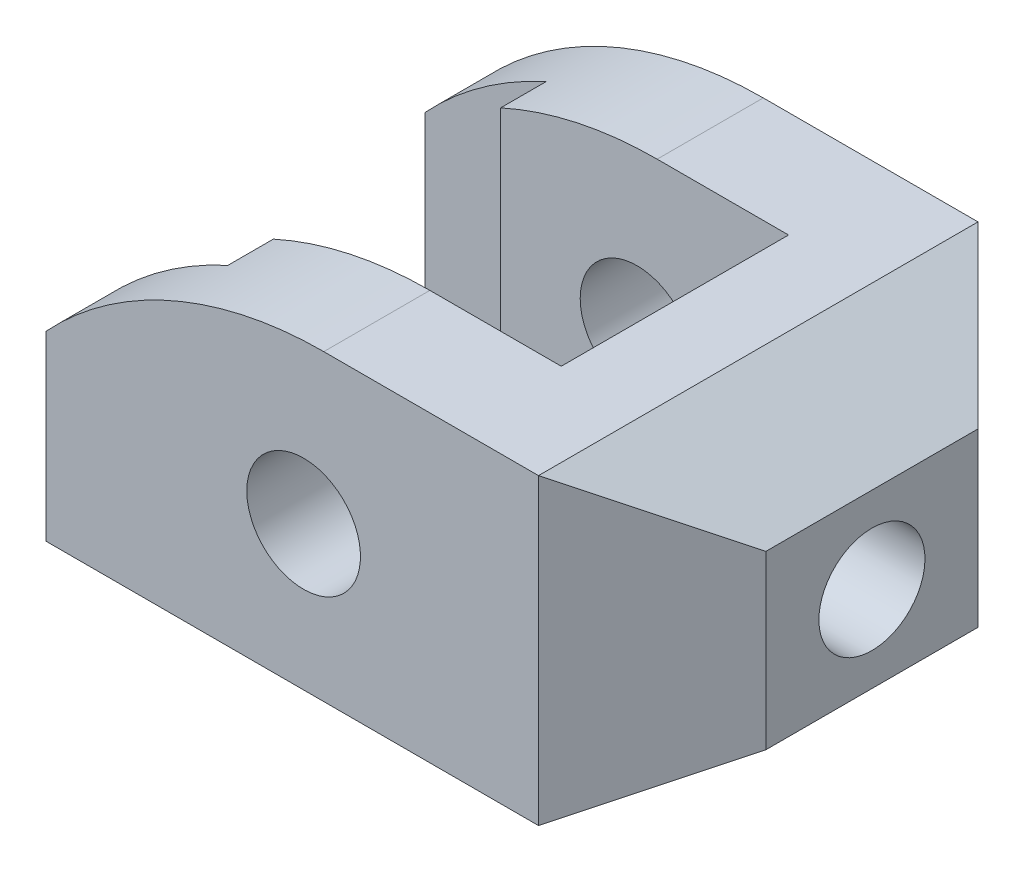
ISO-10303-21;
HEADER;
FILE_DESCRIPTION(('STEP AP214'),'2;1');
FILE_NAME('part.step','',(''),(''),'','','');
FILE_SCHEMA(('AUTOMOTIVE_DESIGN { 1 0 10303 214 1 1 1 1 }'));
ENDSEC;
DATA;
#1=APPLICATION_CONTEXT('core data for automotive mechanical design processes');
#2=APPLICATION_PROTOCOL_DEFINITION('international standard','automotive_design',2000,#1);
#3=PRODUCT_CONTEXT('',#1,'mechanical');
#4=PRODUCT('Part','Part','',(#3));
#5=PRODUCT_RELATED_PRODUCT_CATEGORY('part','',(#4));
#6=PRODUCT_DEFINITION_FORMATION('','',#4);
#7=PRODUCT_DEFINITION_CONTEXT('part definition',#1,'design');
#8=PRODUCT_DEFINITION('design','',#6,#7);
#9=PRODUCT_DEFINITION_SHAPE('','',#8);
#10=(LENGTH_UNIT() NAMED_UNIT(*) SI_UNIT(.MILLI.,.METRE.));
#11=(NAMED_UNIT(*) PLANE_ANGLE_UNIT() SI_UNIT($,.RADIAN.));
#12=(NAMED_UNIT(*) SI_UNIT($,.STERADIAN.) SOLID_ANGLE_UNIT());
#13=UNCERTAINTY_MEASURE_WITH_UNIT(LENGTH_MEASURE(1.E-05),#10,'distance_accuracy_value','');
#14=(GEOMETRIC_REPRESENTATION_CONTEXT(3) GLOBAL_UNCERTAINTY_ASSIGNED_CONTEXT((#13)) GLOBAL_UNIT_ASSIGNED_CONTEXT((#10,
#11,#12)) REPRESENTATION_CONTEXT('',''));
#15=CARTESIAN_POINT('',(0.,0.,0.));
#16=DIRECTION('',(0.,0.,1.));
#17=DIRECTION('',(1.,0.,0.));
#18=AXIS2_PLACEMENT_3D('',#15,#16,#17);
#19=CARTESIAN_POINT('',(2.66060555964671,-29.,58.));
#20=DIRECTION('',(0.,0.,-1.));
#21=DIRECTION('',(-1.,0.,0.));
#22=AXIS2_PLACEMENT_3D('',#19,#20,#21);
#23=CYLINDRICAL_SURFACE('',#22,50.);
#24=CARTESIAN_POINT('',(2.66060555964671,-29.,50.));
#25=DIRECTION('',(0.,0.,-1.));
#26=DIRECTION('',(-1.,0.,0.));
#27=AXIS2_PLACEMENT_3D('',#24,#25,#26);
#28=CIRCLE('',#27,50.);
#29=CARTESIAN_POINT('',(-34.,5.00000000000002,50.));
#30=VERTEX_POINT('',#29);
#31=CARTESIAN_POINT('',(-18.,16.5317403347236,50.));
#32=VERTEX_POINT('',#31);
#33=EDGE_CURVE('E254',#30,#32,#28,.T.);
#34=ORIENTED_EDGE('',*,*,#33,.F.);
#35=DIRECTION('',(0.,0.,-1.));
#36=VECTOR('',#35,1.);
#37=CARTESIAN_POINT('',(-34.,5.,58.));
#38=LINE('',#37,#36);
#39=CARTESIAN_POINT('',(-34.,5.,58.));
#40=VERTEX_POINT('',#39);
#41=EDGE_CURVE('E202',#40,#30,#38,.T.);
#42=ORIENTED_EDGE('',*,*,#41,.F.);
#43=CARTESIAN_POINT('',(2.66060555964671,-29.,58.));
#44=DIRECTION('',(0.,0.,1.));
#45=DIRECTION('',(-1.,0.,0.));
#46=AXIS2_PLACEMENT_3D('',#43,#44,#45);
#47=CIRCLE('',#46,50.);
#48=CARTESIAN_POINT('',(2.66060555964671,21.,58.));
#49=VERTEX_POINT('',#48);
#50=EDGE_CURVE('E237',#49,#40,#47,.T.);
#51=ORIENTED_EDGE('',*,*,#50,.F.);
#52=DIRECTION('',(0.,0.,-1.));
#53=VECTOR('',#52,1.);
#54=CARTESIAN_POINT('',(2.66060555964671,21.,58.));
#55=LINE('',#54,#53);
#56=CARTESIAN_POINT('',(2.66060555964671,21.,44.));
#57=VERTEX_POINT('',#56);
#58=EDGE_CURVE('E231',#49,#57,#55,.T.);
#59=ORIENTED_EDGE('',*,*,#58,.T.);
#60=CARTESIAN_POINT('',(2.66060555964671,-29.,44.));
#61=DIRECTION('',(0.,0.,-1.));
#62=DIRECTION('',(-1.,0.,0.));
#63=AXIS2_PLACEMENT_3D('',#60,#61,#62);
#64=CIRCLE('',#63,50.);
#65=CARTESIAN_POINT('',(-18.,16.5317403347236,44.));
#66=VERTEX_POINT('',#65);
#67=EDGE_CURVE('E264',#66,#57,#64,.T.);
#68=ORIENTED_EDGE('',*,*,#67,.F.);
#69=DIRECTION('',(0.,0.,-1.));
#70=VECTOR('',#69,1.);
#71=CARTESIAN_POINT('',(-18.,16.5317403347236,58.));
#72=LINE('',#71,#70);
#73=EDGE_CURVE('E258',#32,#66,#72,.T.);
#74=ORIENTED_EDGE('',*,*,#73,.F.);
#75=EDGE_LOOP('',(#34,#42,#51,#59,#68,#74));
#76=FACE_BOUND('',#75,.T.);
#77=ADVANCED_FACE('F40',(#76),#23,.T.);
#78=CARTESIAN_POINT('',(2.66060555964671,-29.,14.));
#79=DIRECTION('',(0.,0.,1.));
#80=DIRECTION('',(1.,0.,0.));
#81=AXIS2_PLACEMENT_3D('',#78,#79,#80);
#82=CIRCLE('',#81,50.);
#83=CARTESIAN_POINT('',(2.66060555964671,21.,14.));
#84=VERTEX_POINT('',#83);
#85=CARTESIAN_POINT('',(-18.,16.5317403347236,14.));
#86=VERTEX_POINT('',#85);
#87=EDGE_CURVE('E215',#84,#86,#82,.T.);
#88=ORIENTED_EDGE('',*,*,#87,.F.);
#89=CARTESIAN_POINT('',(2.66060555964671,21.,0.));
#90=VERTEX_POINT('',#89);
#91=EDGE_CURVE('E234',#84,#90,#55,.T.);
#92=ORIENTED_EDGE('',*,*,#91,.T.);
#93=CARTESIAN_POINT('',(2.66060555964671,-29.,0.));
#94=DIRECTION('',(0.,0.,1.));
#95=DIRECTION('',(-1.,0.,0.));
#96=AXIS2_PLACEMENT_3D('',#93,#94,#95);
#97=CIRCLE('',#96,50.);
#98=CARTESIAN_POINT('',(-34.,5.,0.));
#99=VERTEX_POINT('',#98);
#100=EDGE_CURVE('E240',#90,#99,#97,.T.);
#101=ORIENTED_EDGE('',*,*,#100,.T.);
#102=CARTESIAN_POINT('',(-34.,5.00000000000002,8.));
#103=VERTEX_POINT('',#102);
#104=EDGE_CURVE('E201',#103,#99,#38,.T.);
#105=ORIENTED_EDGE('',*,*,#104,.F.);
#106=CARTESIAN_POINT('',(2.66060555964671,-29.,8.00000000000001));
#107=DIRECTION('',(0.,0.,1.));
#108=DIRECTION('',(1.,0.,0.));
#109=AXIS2_PLACEMENT_3D('',#106,#107,#108);
#110=CIRCLE('',#109,50.);
#111=CARTESIAN_POINT('',(-18.,16.5317403347236,8.));
#112=VERTEX_POINT('',#111);
#113=EDGE_CURVE('E262',#112,#103,#110,.T.);
#114=ORIENTED_EDGE('',*,*,#113,.F.);
#115=DIRECTION('',(0.,0.,-1.));
#116=VECTOR('',#115,1.);
#117=CARTESIAN_POINT('',(-18.,16.5317403347236,58.));
#118=LINE('',#117,#116);
#119=EDGE_CURVE('E260',#86,#112,#118,.T.);
#120=ORIENTED_EDGE('',*,*,#119,.F.);
#121=EDGE_LOOP('',(#88,#92,#101,#105,#114,#120));
#122=FACE_BOUND('',#121,.T.);
#123=ADVANCED_FACE('F331',(#122),#23,.T.);
#124=CARTESIAN_POINT('',(-34.,5.,58.));
#125=DIRECTION('',(1.,0.,0.));
#126=DIRECTION('',(0.,1.,0.));
#127=AXIS2_PLACEMENT_3D('',#124,#125,#126);
#128=PLANE('',#127);
#129=DIRECTION('',(0.,-1.,0.));
#130=VECTOR('',#129,1.);
#131=CARTESIAN_POINT('',(-34.,39.,50.));
#132=LINE('',#131,#130);
#133=CARTESIAN_POINT('',(-34.,-19.,50.));
#134=VERTEX_POINT('',#133);
#135=EDGE_CURVE('E210',#30,#134,#132,.T.);
#136=ORIENTED_EDGE('',*,*,#135,.T.);
#137=DIRECTION('',(0.,0.,-1.));
#138=VECTOR('',#137,1.);
#139=CARTESIAN_POINT('',(-34.,-19.,58.));
#140=LINE('',#139,#138);
#141=CARTESIAN_POINT('',(-34.,-19.,58.));
#142=VERTEX_POINT('',#141);
#143=EDGE_CURVE('E194',#142,#134,#140,.T.);
#144=ORIENTED_EDGE('',*,*,#143,.F.);
#145=DIRECTION('',(0.,-1.,0.));
#146=VECTOR('',#145,1.);
#147=CARTESIAN_POINT('',(-34.,5.,58.));
#148=LINE('',#147,#146);
#149=EDGE_CURVE('E247',#40,#142,#148,.T.);
#150=ORIENTED_EDGE('',*,*,#149,.F.);
#151=ORIENTED_EDGE('',*,*,#41,.T.);
#152=EDGE_LOOP('',(#136,#144,#150,#151));
#153=FACE_BOUND('',#152,.T.);
#154=ADVANCED_FACE('F375',(#153),#128,.F.);
#155=DIRECTION('',(0.,-1.,0.));
#156=VECTOR('',#155,1.);
#157=CARTESIAN_POINT('',(-34.,39.,8.));
#158=LINE('',#157,#156);
#159=CARTESIAN_POINT('',(-34.,-19.,8.));
#160=VERTEX_POINT('',#159);
#161=EDGE_CURVE('E269',#103,#160,#158,.T.);
#162=ORIENTED_EDGE('',*,*,#161,.F.);
#163=ORIENTED_EDGE('',*,*,#104,.T.);
#164=DIRECTION('',(0.,-1.,0.));
#165=VECTOR('',#164,1.);
#166=CARTESIAN_POINT('',(-34.,5.,0.));
#167=LINE('',#166,#165);
#168=CARTESIAN_POINT('',(-34.,-19.,0.));
#169=VERTEX_POINT('',#168);
#170=EDGE_CURVE('E187',#99,#169,#167,.T.);
#171=ORIENTED_EDGE('',*,*,#170,.T.);
#172=EDGE_CURVE('E185',#160,#169,#140,.T.);
#173=ORIENTED_EDGE('',*,*,#172,.F.);
#174=EDGE_LOOP('',(#162,#163,#171,#173));
#175=FACE_BOUND('',#174,.T.);
#176=ADVANCED_FACE('F379',(#175),#128,.F.);
#177=CARTESIAN_POINT('',(-34.,-19.,58.));
#178=DIRECTION('',(0.,1.,0.));
#179=DIRECTION('',(-1.,0.,0.));
#180=AXIS2_PLACEMENT_3D('',#177,#178,#179);
#181=PLANE('',#180);
#182=DIRECTION('',(1.,0.,0.));
#183=VECTOR('',#182,1.);
#184=CARTESIAN_POINT('',(0.,-19.,50.));
#185=LINE('',#184,#183);
#186=CARTESIAN_POINT('',(-18.,-19.,50.));
#187=VERTEX_POINT('',#186);
#188=EDGE_CURVE('E272',#134,#187,#185,.T.);
#189=ORIENTED_EDGE('',*,*,#188,.T.);
#190=DIRECTION('',(0.,0.,-1.));
#191=VECTOR('',#190,1.);
#192=CARTESIAN_POINT('',(-18.,-19.,0.));
#193=LINE('',#192,#191);
#194=CARTESIAN_POINT('',(-18.,-19.,44.));
#195=VERTEX_POINT('',#194);
#196=EDGE_CURVE('E286',#187,#195,#193,.T.);
#197=ORIENTED_EDGE('',*,*,#196,.T.);
#198=DIRECTION('',(1.,0.,0.));
#199=VECTOR('',#198,1.);
#200=CARTESIAN_POINT('',(0.,-19.,44.));
#201=LINE('',#200,#199);
#202=CARTESIAN_POINT('',(20.,-19.,44.));
#203=VERTEX_POINT('',#202);
#204=EDGE_CURVE('E289',#195,#203,#201,.T.);
#205=ORIENTED_EDGE('',*,*,#204,.T.);
#206=DIRECTION('',(0.,0.,-1.));
#207=VECTOR('',#206,1.);
#208=CARTESIAN_POINT('',(20.,-19.,0.));
#209=LINE('',#208,#207);
#210=CARTESIAN_POINT('',(20.,-19.,14.));
#211=VERTEX_POINT('',#210);
#212=EDGE_CURVE('E292',#203,#211,#209,.T.);
#213=ORIENTED_EDGE('',*,*,#212,.T.);
#214=DIRECTION('',(-1.,0.,0.));
#215=VECTOR('',#214,1.);
#216=CARTESIAN_POINT('',(0.,-19.,14.));
#217=LINE('',#216,#215);
#218=CARTESIAN_POINT('',(-18.,-19.,14.));
#219=VERTEX_POINT('',#218);
#220=EDGE_CURVE('E295',#211,#219,#217,.T.);
#221=ORIENTED_EDGE('',*,*,#220,.T.);
#222=DIRECTION('',(0.,0.,-1.));
#223=VECTOR('',#222,1.);
#224=CARTESIAN_POINT('',(-18.,-19.,0.));
#225=LINE('',#224,#223);
#226=CARTESIAN_POINT('',(-18.,-19.,8.));
#227=VERTEX_POINT('',#226);
#228=EDGE_CURVE('E298',#219,#227,#225,.T.);
#229=ORIENTED_EDGE('',*,*,#228,.T.);
#230=DIRECTION('',(-1.,0.,0.));
#231=VECTOR('',#230,1.);
#232=CARTESIAN_POINT('',(0.,-19.,8.00000000000001));
#233=LINE('',#232,#231);
#234=EDGE_CURVE('E301',#227,#160,#233,.T.);
#235=ORIENTED_EDGE('',*,*,#234,.T.);
#236=ORIENTED_EDGE('',*,*,#172,.T.);
#237=DIRECTION('',(1.,0.,0.));
#238=VECTOR('',#237,1.);
#239=CARTESIAN_POINT('',(-34.,-19.,0.));
#240=LINE('',#239,#238);
#241=CARTESIAN_POINT('',(31.,-19.,0.));
#242=VERTEX_POINT('',#241);
#243=EDGE_CURVE('E171',#169,#242,#240,.T.);
#244=ORIENTED_EDGE('',*,*,#243,.T.);
#245=DIRECTION('',(0.,0.,-1.));
#246=VECTOR('',#245,1.);
#247=CARTESIAN_POINT('',(31.,-19.,58.));
#248=LINE('',#247,#246);
#249=CARTESIAN_POINT('',(31.,-19.,58.));
#250=VERTEX_POINT('',#249);
#251=EDGE_CURVE('E182',#250,#242,#248,.T.);
#252=ORIENTED_EDGE('',*,*,#251,.F.);
#253=DIRECTION('',(1.,0.,0.));
#254=VECTOR('',#253,1.);
#255=CARTESIAN_POINT('',(-34.,-19.,58.));
#256=LINE('',#255,#254);
#257=EDGE_CURVE('E245',#142,#250,#256,.T.);
#258=ORIENTED_EDGE('',*,*,#257,.F.);
#259=ORIENTED_EDGE('',*,*,#143,.T.);
#260=EDGE_LOOP('',(#189,#197,#205,#213,#221,#229,#235,#236,#244,#252,#258,#259));
#261=FACE_BOUND('',#260,.T.);
#262=ADVANCED_FACE('F180',(#261),#181,.F.);
#263=CARTESIAN_POINT('',(31.,21.,58.));
#264=DIRECTION('',(0.,-1.,0.));
#265=DIRECTION('',(1.,0.,0.));
#266=AXIS2_PLACEMENT_3D('',#263,#264,#265);
#267=PLANE('',#266);
#268=DIRECTION('',(1.,0.,0.));
#269=VECTOR('',#268,1.);
#270=CARTESIAN_POINT('',(31.,21.,44.));
#271=LINE('',#270,#269);
#272=CARTESIAN_POINT('',(20.,21.,44.));
#273=VERTEX_POINT('',#272);
#274=EDGE_CURVE('E214',#57,#273,#271,.T.);
#275=ORIENTED_EDGE('',*,*,#274,.F.);
#276=ORIENTED_EDGE('',*,*,#58,.F.);
#277=DIRECTION('',(-1.,0.,0.));
#278=VECTOR('',#277,1.);
#279=CARTESIAN_POINT('',(31.,21.,58.));
#280=LINE('',#279,#278);
#281=CARTESIAN_POINT('',(31.,21.,58.));
#282=VERTEX_POINT('',#281);
#283=EDGE_CURVE('E230',#282,#49,#280,.T.);
#284=ORIENTED_EDGE('',*,*,#283,.F.);
#285=DIRECTION('',(0.,0.,-1.));
#286=VECTOR('',#285,1.);
#287=CARTESIAN_POINT('',(31.,21.,58.));
#288=LINE('',#287,#286);
#289=CARTESIAN_POINT('',(31.,21.,0.));
#290=VERTEX_POINT('',#289);
#291=EDGE_CURVE('E222',#282,#290,#288,.T.);
#292=ORIENTED_EDGE('',*,*,#291,.T.);
#293=DIRECTION('',(-1.,0.,0.));
#294=VECTOR('',#293,1.);
#295=CARTESIAN_POINT('',(31.,21.,0.));
#296=LINE('',#295,#294);
#297=EDGE_CURVE('E174',#290,#90,#296,.T.);
#298=ORIENTED_EDGE('',*,*,#297,.T.);
#299=ORIENTED_EDGE('',*,*,#91,.F.);
#300=DIRECTION('',(-1.,0.,0.));
#301=VECTOR('',#300,1.);
#302=CARTESIAN_POINT('',(31.,21.,14.));
#303=LINE('',#302,#301);
#304=CARTESIAN_POINT('',(20.,21.,14.));
#305=VERTEX_POINT('',#304);
#306=EDGE_CURVE('E209',#305,#84,#303,.T.);
#307=ORIENTED_EDGE('',*,*,#306,.F.);
#308=DIRECTION('',(0.,0.,-1.));
#309=VECTOR('',#308,1.);
#310=CARTESIAN_POINT('',(20.,21.,58.));
#311=LINE('',#310,#309);
#312=EDGE_CURVE('E205',#273,#305,#311,.T.);
#313=ORIENTED_EDGE('',*,*,#312,.F.);
#314=EDGE_LOOP('',(#275,#276,#284,#292,#298,#299,#307,#313));
#315=FACE_BOUND('',#314,.T.);
#316=ADVANCED_FACE('F227',(#315),#267,.F.);
#317=CARTESIAN_POINT('',(0.,0.,58.));
#318=DIRECTION('',(0.,0.,-1.));
#319=DIRECTION('',(-1.,0.,0.));
#320=AXIS2_PLACEMENT_3D('',#317,#318,#319);
#321=CYLINDRICAL_SURFACE('',#320,7.5);
#322=CARTESIAN_POINT('',(0.,0.,58.));
#323=DIRECTION('',(0.,0.,1.));
#324=DIRECTION('',(1.,0.,0.));
#325=AXIS2_PLACEMENT_3D('',#322,#323,#324);
#326=CIRCLE('',#325,7.5);
#327=CARTESIAN_POINT('',(-7.50000000000001,0.,58.));
#328=VERTEX_POINT('',#327);
#329=EDGE_CURVE('E243',#328,#328,#326,.T.);
#330=CARTESIAN_POINT('',(0.,0.,44.));
#331=DIRECTION('',(0.,0.,-1.));
#332=DIRECTION('',(-1.,0.,0.));
#333=AXIS2_PLACEMENT_3D('',#330,#331,#332);
#334=CIRCLE('',#333,7.5);
#335=CARTESIAN_POINT('',(-7.50000000000001,0.,44.));
#336=VERTEX_POINT('',#335);
#337=EDGE_CURVE('E211',#336,#336,#334,.T.);
#338=CARTESIAN_POINT('',(-7.50000000000001,0.,58.));
#339=CARTESIAN_POINT('',(-7.50000000000001,0.,57.8541666666667));
#340=CARTESIAN_POINT('',(-7.50000000000001,0.,57.7083333333333));
#341=CARTESIAN_POINT('',(-7.50000000000001,0.,57.4166666666667));
#342=CARTESIAN_POINT('',(-7.50000000000001,0.,57.2708333333333));
#343=CARTESIAN_POINT('',(-7.50000000000001,0.,56.9791666666667));
#344=CARTESIAN_POINT('',(-7.50000000000001,0.,56.8333333333333));
#345=CARTESIAN_POINT('',(-7.50000000000001,0.,56.5416666666667));
#346=CARTESIAN_POINT('',(-7.50000000000001,0.,56.3958333333333));
#347=CARTESIAN_POINT('',(-7.50000000000001,0.,56.1041666666667));
#348=CARTESIAN_POINT('',(-7.50000000000001,0.,55.9583333333333));
#349=CARTESIAN_POINT('',(-7.50000000000001,0.,55.6666666666667));
#350=CARTESIAN_POINT('',(-7.50000000000001,0.,55.5208333333333));
#351=CARTESIAN_POINT('',(-7.50000000000001,0.,55.2291666666667));
#352=CARTESIAN_POINT('',(-7.50000000000001,0.,55.0833333333333));
#353=CARTESIAN_POINT('',(-7.50000000000001,0.,54.7916666666667));
#354=CARTESIAN_POINT('',(-7.50000000000001,0.,54.6458333333333));
#355=CARTESIAN_POINT('',(-7.50000000000001,0.,54.3541666666667));
#356=CARTESIAN_POINT('',(-7.50000000000001,0.,54.2083333333333));
#357=CARTESIAN_POINT('',(-7.50000000000001,0.,53.9166666666667));
#358=CARTESIAN_POINT('',(-7.50000000000001,0.,53.7708333333333));
#359=CARTESIAN_POINT('',(-7.50000000000001,0.,53.4791666666667));
#360=CARTESIAN_POINT('',(-7.50000000000001,0.,53.3333333333333));
#361=CARTESIAN_POINT('',(-7.50000000000001,0.,53.0416666666667));
#362=CARTESIAN_POINT('',(-7.50000000000001,0.,52.8958333333333));
#363=CARTESIAN_POINT('',(-7.50000000000001,0.,52.6041666666667));
#364=CARTESIAN_POINT('',(-7.50000000000001,0.,52.4583333333333));
#365=CARTESIAN_POINT('',(-7.50000000000001,0.,52.1666666666667));
#366=CARTESIAN_POINT('',(-7.50000000000001,0.,52.0208333333333));
#367=CARTESIAN_POINT('',(-7.50000000000001,0.,51.7291666666667));
#368=CARTESIAN_POINT('',(-7.50000000000001,0.,51.5833333333333));
#369=CARTESIAN_POINT('',(-7.50000000000001,0.,51.2916666666667));
#370=CARTESIAN_POINT('',(-7.50000000000001,0.,51.1458333333333));
#371=CARTESIAN_POINT('',(-7.50000000000001,0.,50.8541666666667));
#372=CARTESIAN_POINT('',(-7.50000000000001,0.,50.7083333333333));
#373=CARTESIAN_POINT('',(-7.50000000000001,0.,50.4166666666667));
#374=CARTESIAN_POINT('',(-7.50000000000001,0.,50.2708333333333));
#375=CARTESIAN_POINT('',(-7.50000000000001,0.,49.9791666666667));
#376=CARTESIAN_POINT('',(-7.50000000000001,0.,49.8333333333333));
#377=CARTESIAN_POINT('',(-7.50000000000001,0.,49.5416666666667));
#378=CARTESIAN_POINT('',(-7.50000000000001,0.,49.3958333333333));
#379=CARTESIAN_POINT('',(-7.50000000000001,0.,49.1041666666667));
#380=CARTESIAN_POINT('',(-7.50000000000001,0.,48.9583333333333));
#381=CARTESIAN_POINT('',(-7.50000000000001,0.,48.6666666666667));
#382=CARTESIAN_POINT('',(-7.50000000000001,0.,48.5208333333333));
#383=CARTESIAN_POINT('',(-7.50000000000001,0.,48.2291666666667));
#384=CARTESIAN_POINT('',(-7.50000000000001,0.,48.0833333333333));
#385=CARTESIAN_POINT('',(-7.50000000000001,0.,47.7916666666667));
#386=CARTESIAN_POINT('',(-7.50000000000001,0.,47.6458333333333));
#387=CARTESIAN_POINT('',(-7.50000000000001,0.,47.3541666666667));
#388=CARTESIAN_POINT('',(-7.50000000000001,0.,47.2083333333333));
#389=CARTESIAN_POINT('',(-7.50000000000001,0.,46.9166666666667));
#390=CARTESIAN_POINT('',(-7.50000000000001,0.,46.7708333333333));
#391=CARTESIAN_POINT('',(-7.50000000000001,0.,46.4791666666667));
#392=CARTESIAN_POINT('',(-7.50000000000001,0.,46.3333333333333));
#393=CARTESIAN_POINT('',(-7.50000000000001,0.,46.0416666666667));
#394=CARTESIAN_POINT('',(-7.50000000000001,0.,45.8958333333333));
#395=CARTESIAN_POINT('',(-7.50000000000001,0.,45.6041666666667));
#396=CARTESIAN_POINT('',(-7.50000000000001,0.,45.4583333333333));
#397=CARTESIAN_POINT('',(-7.50000000000001,0.,45.1666666666667));
#398=CARTESIAN_POINT('',(-7.50000000000001,0.,45.0208333333333));
#399=CARTESIAN_POINT('',(-7.50000000000001,0.,44.7291666666667));
#400=CARTESIAN_POINT('',(-7.50000000000001,0.,44.5833333333333));
#401=CARTESIAN_POINT('',(-7.50000000000001,0.,44.2916666666667));
#402=CARTESIAN_POINT('',(-7.50000000000001,0.,44.1458333333333));
#403=CARTESIAN_POINT('',(-7.50000000000001,0.,44.));
#404=B_SPLINE_CURVE_WITH_KNOTS('',3,(#338,#339,#340,#341,#342,#343,#344,#345,#346,#347,#348,
#349,#350,#351,#352,#353,#354,#355,#356,#357,#358,#359,#360,#361,#362,#363,#364,#365,#366,#367,
#368,#369,#370,#371,#372,#373,#374,#375,#376,#377,#378,#379,#380,#381,#382,#383,#384,#385,#386,
#387,#388,#389,#390,#391,#392,#393,#394,#395,#396,#397,#398,#399,#400,#401,#402,#403),
.UNSPECIFIED.,.F.,.F.,(4,2,2,2,2,2,2,2,2,2,2,2,2,2,2,2,2,2,2,2,2,2,2,2,2,2,2,2,2,2,2,2,4),(0.,
0.4375,0.875000000000001,1.3125,1.75,2.1875,2.625,3.0625,3.5,3.9375,4.375,4.8125,5.25,5.6875,
6.125,6.5625,7.,7.4375,7.875,8.3125,8.75,9.18749999999999,9.625,10.0625,10.5,10.9375,11.375,
11.8125,12.25,12.6875,13.125,13.5625,14.),.UNSPECIFIED.);
#405=EDGE_CURVE('BSEAM391',#328,#336,#404,.T.);
#406=ORIENTED_EDGE('',*,*,#329,.T.);
#407=ORIENTED_EDGE('',*,*,#337,.T.);
#408=ORIENTED_EDGE('',*,*,#405,.T.);
#409=ORIENTED_EDGE('',*,*,#405,.F.);
#410=EDGE_LOOP('',(#406,#408,#407,#409));
#411=FACE_BOUND('',#410,.T.);
#412=ADVANCED_FACE('F391',(#411),#321,.F.);
#413=CARTESIAN_POINT('',(0.,0.,0.));
#414=DIRECTION('',(0.,0.,1.));
#415=DIRECTION('',(1.,0.,0.));
#416=AXIS2_PLACEMENT_3D('',#413,#414,#415);
#417=CIRCLE('',#416,7.5);
#418=CARTESIAN_POINT('',(-7.50000000000001,0.,0.));
#419=VERTEX_POINT('',#418);
#420=EDGE_CURVE('E251',#419,#419,#417,.T.);
#421=CARTESIAN_POINT('',(0.,0.,14.));
#422=DIRECTION('',(0.,0.,1.));
#423=DIRECTION('',(1.,0.,0.));
#424=AXIS2_PLACEMENT_3D('',#421,#422,#423);
#425=CIRCLE('',#424,7.5);
#426=CARTESIAN_POINT('',(-7.50000000000001,0.,14.));
#427=VERTEX_POINT('',#426);
#428=EDGE_CURVE('E206',#427,#427,#425,.T.);
#429=CARTESIAN_POINT('',(-7.50000000000001,0.,0.));
#430=CARTESIAN_POINT('',(-7.50000000000001,0.,0.145833333333333));
#431=CARTESIAN_POINT('',(-7.50000000000001,0.,0.291666666666667));
#432=CARTESIAN_POINT('',(-7.50000000000001,0.,0.583333333333334));
#433=CARTESIAN_POINT('',(-7.50000000000001,0.,0.729166666666667));
#434=CARTESIAN_POINT('',(-7.50000000000001,0.,1.02083333333333));
#435=CARTESIAN_POINT('',(-7.50000000000001,0.,1.16666666666667));
#436=CARTESIAN_POINT('',(-7.50000000000001,0.,1.45833333333333));
#437=CARTESIAN_POINT('',(-7.50000000000001,0.,1.60416666666667));
#438=CARTESIAN_POINT('',(-7.50000000000001,0.,1.89583333333334));
#439=CARTESIAN_POINT('',(-7.50000000000001,0.,2.04166666666667));
#440=CARTESIAN_POINT('',(-7.50000000000001,0.,2.33333333333334));
#441=CARTESIAN_POINT('',(-7.50000000000001,0.,2.47916666666667));
#442=CARTESIAN_POINT('',(-7.50000000000001,0.,2.77083333333334));
#443=CARTESIAN_POINT('',(-7.50000000000001,0.,2.91666666666667));
#444=CARTESIAN_POINT('',(-7.50000000000001,0.,3.20833333333334));
#445=CARTESIAN_POINT('',(-7.50000000000001,0.,3.35416666666667));
#446=CARTESIAN_POINT('',(-7.50000000000001,0.,3.64583333333333));
#447=CARTESIAN_POINT('',(-7.50000000000001,0.,3.79166666666667));
#448=CARTESIAN_POINT('',(-7.50000000000001,0.,4.08333333333333));
#449=CARTESIAN_POINT('',(-7.50000000000001,0.,4.22916666666666));
#450=CARTESIAN_POINT('',(-7.50000000000001,0.,4.52083333333333));
#451=CARTESIAN_POINT('',(-7.50000000000001,0.,4.66666666666666));
#452=CARTESIAN_POINT('',(-7.50000000000001,0.,4.95833333333333));
#453=CARTESIAN_POINT('',(-7.50000000000001,0.,5.10416666666666));
#454=CARTESIAN_POINT('',(-7.50000000000001,0.,5.39583333333333));
#455=CARTESIAN_POINT('',(-7.50000000000001,0.,5.54166666666666));
#456=CARTESIAN_POINT('',(-7.50000000000001,0.,5.83333333333333));
#457=CARTESIAN_POINT('',(-7.50000000000001,0.,5.97916666666667));
#458=CARTESIAN_POINT('',(-7.50000000000001,0.,6.27083333333333));
#459=CARTESIAN_POINT('',(-7.50000000000001,0.,6.41666666666667));
#460=CARTESIAN_POINT('',(-7.50000000000001,0.,6.70833333333333));
#461=CARTESIAN_POINT('',(-7.50000000000001,0.,6.85416666666667));
#462=CARTESIAN_POINT('',(-7.50000000000001,0.,7.14583333333333));
#463=CARTESIAN_POINT('',(-7.50000000000001,0.,7.29166666666667));
#464=CARTESIAN_POINT('',(-7.50000000000001,0.,7.58333333333333));
#465=CARTESIAN_POINT('',(-7.50000000000001,0.,7.72916666666667));
#466=CARTESIAN_POINT('',(-7.50000000000001,0.,8.02083333333333));
#467=CARTESIAN_POINT('',(-7.50000000000001,0.,8.16666666666667));
#468=CARTESIAN_POINT('',(-7.50000000000001,0.,8.45833333333333));
#469=CARTESIAN_POINT('',(-7.50000000000001,0.,8.60416666666667));
#470=CARTESIAN_POINT('',(-7.50000000000001,0.,8.89583333333333));
#471=CARTESIAN_POINT('',(-7.50000000000001,0.,9.04166666666667));
#472=CARTESIAN_POINT('',(-7.50000000000001,0.,9.33333333333333));
#473=CARTESIAN_POINT('',(-7.50000000000001,0.,9.47916666666666));
#474=CARTESIAN_POINT('',(-7.50000000000001,0.,9.77083333333333));
#475=CARTESIAN_POINT('',(-7.50000000000001,0.,9.91666666666667));
#476=CARTESIAN_POINT('',(-7.50000000000001,0.,10.2083333333333));
#477=CARTESIAN_POINT('',(-7.50000000000001,0.,10.3541666666667));
#478=CARTESIAN_POINT('',(-7.50000000000001,0.,10.6458333333333));
#479=CARTESIAN_POINT('',(-7.50000000000001,0.,10.7916666666667));
#480=CARTESIAN_POINT('',(-7.50000000000001,0.,11.0833333333333));
#481=CARTESIAN_POINT('',(-7.50000000000001,0.,11.2291666666667));
#482=CARTESIAN_POINT('',(-7.50000000000001,0.,11.5208333333333));
#483=CARTESIAN_POINT('',(-7.50000000000001,0.,11.6666666666667));
#484=CARTESIAN_POINT('',(-7.50000000000001,0.,11.9583333333333));
#485=CARTESIAN_POINT('',(-7.50000000000001,0.,12.1041666666667));
#486=CARTESIAN_POINT('',(-7.50000000000001,0.,12.3958333333333));
#487=CARTESIAN_POINT('',(-7.50000000000001,0.,12.5416666666667));
#488=CARTESIAN_POINT('',(-7.50000000000001,0.,12.8333333333333));
#489=CARTESIAN_POINT('',(-7.50000000000001,0.,12.9791666666667));
#490=CARTESIAN_POINT('',(-7.50000000000001,0.,13.2708333333333));
#491=CARTESIAN_POINT('',(-7.50000000000001,0.,13.4166666666667));
#492=CARTESIAN_POINT('',(-7.50000000000001,0.,13.7083333333333));
#493=CARTESIAN_POINT('',(-7.50000000000001,0.,13.8541666666667));
#494=CARTESIAN_POINT('',(-7.50000000000001,0.,14.));
#495=B_SPLINE_CURVE_WITH_KNOTS('',3,(#429,#430,#431,#432,#433,#434,#435,#436,#437,#438,#439,
#440,#441,#442,#443,#444,#445,#446,#447,#448,#449,#450,#451,#452,#453,#454,#455,#456,#457,#458,
#459,#460,#461,#462,#463,#464,#465,#466,#467,#468,#469,#470,#471,#472,#473,#474,#475,#476,#477,
#478,#479,#480,#481,#482,#483,#484,#485,#486,#487,#488,#489,#490,#491,#492,#493,#494),
.UNSPECIFIED.,.F.,.F.,(4,2,2,2,2,2,2,2,2,2,2,2,2,2,2,2,2,2,2,2,2,2,2,2,2,2,2,2,2,2,2,2,4),(0.,
0.4375,0.875000000000001,1.3125,1.75,2.1875,2.625,3.0625,3.5,3.9375,4.375,4.8125,5.25,5.6875,
6.125,6.5625,7.,7.4375,7.875,8.3125,8.75,9.1875,9.62499999999999,10.0625,10.5,10.9375,11.375,
11.8125,12.25,12.6875,13.125,13.5625,14.),.UNSPECIFIED.);
#496=EDGE_CURVE('BSEAM397',#419,#427,#495,.T.);
#497=ORIENTED_EDGE('',*,*,#420,.F.);
#498=ORIENTED_EDGE('',*,*,#428,.T.);
#499=ORIENTED_EDGE('',*,*,#496,.T.);
#500=ORIENTED_EDGE('',*,*,#496,.F.);
#501=EDGE_LOOP('',(#497,#499,#498,#500));
#502=FACE_BOUND('',#501,.T.);
#503=ADVANCED_FACE('F397',(#502),#321,.F.);
#504=CARTESIAN_POINT('',(2.66060555964671,-29.,58.));
#505=DIRECTION('',(0.,0.,-1.));
#506=DIRECTION('',(-1.,0.,0.));
#507=AXIS2_PLACEMENT_3D('',#504,#505,#506);
#508=PLANE('',#507);
#509=ORIENTED_EDGE('',*,*,#257,.T.);
#510=DIRECTION('',(0.,-1.,0.));
#511=VECTOR('',#510,1.);
#512=CARTESIAN_POINT('',(31.,58.,58.));
#513=LINE('',#512,#511);
#514=EDGE_CURVE('E175',#282,#250,#513,.T.);
#515=ORIENTED_EDGE('',*,*,#514,.F.);
#516=ORIENTED_EDGE('',*,*,#283,.T.);
#517=ORIENTED_EDGE('',*,*,#50,.T.);
#518=ORIENTED_EDGE('',*,*,#149,.T.);
#519=EDGE_LOOP('',(#509,#515,#516,#517,#518));
#520=FACE_BOUND('',#519,.T.);
#521=ORIENTED_EDGE('',*,*,#329,.F.);
#522=EDGE_LOOP('',(#521));
#523=FACE_BOUND('',#522,.T.);
#524=ADVANCED_FACE('F352',(#520,#523),#508,.F.);
#525=CARTESIAN_POINT('',(2.66060555964671,-29.,0.));
#526=DIRECTION('',(0.,0.,-1.));
#527=DIRECTION('',(-1.,0.,0.));
#528=AXIS2_PLACEMENT_3D('',#525,#526,#527);
#529=PLANE('',#528);
#530=DIRECTION('',(0.,-1.,0.));
#531=VECTOR('',#530,1.);
#532=CARTESIAN_POINT('',(31.,58.,0.));
#533=LINE('',#532,#531);
#534=EDGE_CURVE('E154',#290,#242,#533,.T.);
#535=ORIENTED_EDGE('',*,*,#534,.T.);
#536=ORIENTED_EDGE('',*,*,#243,.F.);
#537=ORIENTED_EDGE('',*,*,#170,.F.);
#538=ORIENTED_EDGE('',*,*,#100,.F.);
#539=ORIENTED_EDGE('',*,*,#297,.F.);
#540=EDGE_LOOP('',(#535,#536,#537,#538,#539));
#541=FACE_BOUND('',#540,.T.);
#542=ORIENTED_EDGE('',*,*,#420,.T.);
#543=EDGE_LOOP('',(#542));
#544=FACE_BOUND('',#543,.T.);
#545=ADVANCED_FACE('F168',(#541,#544),#529,.T.);
#546=CARTESIAN_POINT('',(31.,-19.,58.));
#547=DIRECTION('',(-0.500000000000001,0.866025403784438,0.));
#548=DIRECTION('',(-0.866025403784438,-0.500000000000001,0.));
#549=AXIS2_PLACEMENT_3D('',#546,#547,#548);
#550=PLANE('',#549);
#551=DIRECTION('',(0.,0.,-1.));
#552=VECTOR('',#551,1.);
#553=CARTESIAN_POINT('',(46.,-10.3397459621556,58.));
#554=LINE('',#553,#552);
#555=CARTESIAN_POINT('',(46.,-10.3397459621556,43.0000000000002));
#556=VERTEX_POINT('',#555);
#557=CARTESIAN_POINT('',(46.,-10.3397459621556,15.));
#558=VERTEX_POINT('',#557);
#559=EDGE_CURVE('E192',#556,#558,#554,.T.);
#560=ORIENTED_EDGE('',*,*,#559,.F.);
#561=DIRECTION('',(-0.65465367070798,-0.37796447300923,0.654653670707973));
#562=VECTOR('',#561,1.);
#563=CARTESIAN_POINT('',(31.,-19.,58.));
#564=LINE('',#563,#562);
#565=EDGE_CURVE('E162',#556,#250,#564,.T.);
#566=ORIENTED_EDGE('',*,*,#565,.T.);
#567=ORIENTED_EDGE('',*,*,#251,.T.);
#568=DIRECTION('',(0.654653670707976,0.377964473009228,0.654653670707978));
#569=VECTOR('',#568,1.);
#570=CARTESIAN_POINT('',(55.8571428571429,-4.64872188014355,24.8571428571429));
#571=LINE('',#570,#569);
#572=EDGE_CURVE('E151',#242,#558,#571,.T.);
#573=ORIENTED_EDGE('',*,*,#572,.T.);
#574=EDGE_LOOP('',(#560,#566,#567,#573));
#575=FACE_BOUND('',#574,.T.);
#576=ADVANCED_FACE('F190',(#575),#550,.F.);
#577=CARTESIAN_POINT('',(46.,-10.3397459621556,58.));
#578=DIRECTION('',(-1.,0.,0.));
#579=DIRECTION('',(0.,-1.,0.));
#580=AXIS2_PLACEMENT_3D('',#577,#578,#579);
#581=PLANE('',#580);
#582=CARTESIAN_POINT('',(46.,1.00000000000001,29.0000000000001));
#583=DIRECTION('',(1.,0.,0.));
#584=DIRECTION('',(0.,1.,0.));
#585=AXIS2_PLACEMENT_3D('',#582,#583,#584);
#586=CIRCLE('',#585,7.);
#587=CARTESIAN_POINT('',(46.,8.00000000000001,29.0000000000001));
#588=VERTEX_POINT('',#587);
#589=EDGE_CURVE('E307',#588,#588,#586,.T.);
#590=ORIENTED_EDGE('',*,*,#589,.F.);
#591=EDGE_LOOP('',(#590));
#592=FACE_BOUND('',#591,.T.);
#593=DIRECTION('',(0.,0.,-1.));
#594=VECTOR('',#593,1.);
#595=CARTESIAN_POINT('',(46.,12.3397459621556,58.));
#596=LINE('',#595,#594);
#597=CARTESIAN_POINT('',(46.,12.3397459621556,43.0000000000002));
#598=VERTEX_POINT('',#597);
#599=CARTESIAN_POINT('',(46.,12.3397459621556,15.));
#600=VERTEX_POINT('',#599);
#601=EDGE_CURVE('E196',#598,#600,#596,.T.);
#602=ORIENTED_EDGE('',*,*,#601,.F.);
#603=DIRECTION('',(0.,-1.,0.));
#604=VECTOR('',#603,1.);
#605=CARTESIAN_POINT('',(46.,58.,43.0000000000002));
#606=LINE('',#605,#604);
#607=EDGE_CURVE('E55',#598,#556,#606,.T.);
#608=ORIENTED_EDGE('',*,*,#607,.T.);
#609=ORIENTED_EDGE('',*,*,#559,.T.);
#610=DIRECTION('',(0.,-1.,0.));
#611=VECTOR('',#610,1.);
#612=CARTESIAN_POINT('',(46.,58.,15.));
#613=LINE('',#612,#611);
#614=EDGE_CURVE('E157',#600,#558,#613,.T.);
#615=ORIENTED_EDGE('',*,*,#614,.F.);
#616=EDGE_LOOP('',(#602,#608,#609,#615));
#617=FACE_BOUND('',#616,.T.);
#618=ADVANCED_FACE('F358',(#592,#617),#581,.F.);
#619=CARTESIAN_POINT('',(46.,12.3397459621556,58.));
#620=DIRECTION('',(-0.500000000000001,-0.866025403784438,0.));
#621=DIRECTION('',(0.866025403784438,-0.500000000000001,0.));
#622=AXIS2_PLACEMENT_3D('',#619,#620,#621);
#623=PLANE('',#622);
#624=ORIENTED_EDGE('',*,*,#291,.F.);
#625=DIRECTION('',(0.65465367070798,-0.37796447300923,-0.654653670707973));
#626=VECTOR('',#625,1.);
#627=CARTESIAN_POINT('',(39.5714285714286,16.051283406946,49.4285714285714));
#628=LINE('',#627,#626);
#629=EDGE_CURVE('E11',#282,#598,#628,.T.);
#630=ORIENTED_EDGE('',*,*,#629,.T.);
#631=ORIENTED_EDGE('',*,*,#601,.T.);
#632=DIRECTION('',(-0.654653670707976,0.377964473009228,-0.654653670707978));
#633=VECTOR('',#632,1.);
#634=CARTESIAN_POINT('',(64.4285714285714,1.70000528708961,33.4285714285715));
#635=LINE('',#634,#633);
#636=EDGE_CURVE('E48',#600,#290,#635,.T.);
#637=ORIENTED_EDGE('',*,*,#636,.T.);
#638=EDGE_LOOP('',(#624,#630,#631,#637));
#639=FACE_BOUND('',#638,.T.);
#640=ADVANCED_FACE('F221',(#639),#623,.F.);
#641=CARTESIAN_POINT('',(0.,39.,50.));
#642=DIRECTION('',(0.,0.,-1.));
#643=DIRECTION('',(-1.,0.,0.));
#644=AXIS2_PLACEMENT_3D('',#641,#642,#643);
#645=PLANE('',#644);
#646=ORIENTED_EDGE('',*,*,#33,.T.);
#647=DIRECTION('',(0.,-1.,0.));
#648=VECTOR('',#647,1.);
#649=CARTESIAN_POINT('',(-18.,39.,50.));
#650=LINE('',#649,#648);
#651=EDGE_CURVE('E281',#32,#187,#650,.T.);
#652=ORIENTED_EDGE('',*,*,#651,.T.);
#653=ORIENTED_EDGE('',*,*,#188,.F.);
#654=ORIENTED_EDGE('',*,*,#135,.F.);
#655=EDGE_LOOP('',(#646,#652,#653,#654));
#656=FACE_BOUND('',#655,.T.);
#657=ADVANCED_FACE('F367',(#656),#645,.T.);
#658=CARTESIAN_POINT('',(-18.,39.,0.));
#659=DIRECTION('',(-1.,0.,0.));
#660=DIRECTION('',(0.,-1.,0.));
#661=AXIS2_PLACEMENT_3D('',#658,#659,#660);
#662=PLANE('',#661);
#663=ORIENTED_EDGE('',*,*,#73,.T.);
#664=DIRECTION('',(0.,-1.,0.));
#665=VECTOR('',#664,1.);
#666=CARTESIAN_POINT('',(-18.,39.,44.));
#667=LINE('',#666,#665);
#668=EDGE_CURVE('E279',#66,#195,#667,.T.);
#669=ORIENTED_EDGE('',*,*,#668,.T.);
#670=ORIENTED_EDGE('',*,*,#196,.F.);
#671=ORIENTED_EDGE('',*,*,#651,.F.);
#672=EDGE_LOOP('',(#663,#669,#670,#671));
#673=FACE_BOUND('',#672,.T.);
#674=ADVANCED_FACE('F408',(#673),#662,.T.);
#675=CARTESIAN_POINT('',(-18.,39.,0.));
#676=DIRECTION('',(-1.,0.,0.));
#677=DIRECTION('',(0.,-1.,0.));
#678=AXIS2_PLACEMENT_3D('',#675,#676,#677);
#679=PLANE('',#678);
#680=ORIENTED_EDGE('',*,*,#119,.T.);
#681=DIRECTION('',(0.,-1.,0.));
#682=VECTOR('',#681,1.);
#683=CARTESIAN_POINT('',(-18.,39.,8.));
#684=LINE('',#683,#682);
#685=EDGE_CURVE('E271',#112,#227,#684,.T.);
#686=ORIENTED_EDGE('',*,*,#685,.T.);
#687=ORIENTED_EDGE('',*,*,#228,.F.);
#688=DIRECTION('',(0.,-1.,0.));
#689=VECTOR('',#688,1.);
#690=CARTESIAN_POINT('',(-18.,39.,14.));
#691=LINE('',#690,#689);
#692=EDGE_CURVE('E274',#86,#219,#691,.T.);
#693=ORIENTED_EDGE('',*,*,#692,.F.);
#694=EDGE_LOOP('',(#680,#686,#687,#693));
#695=FACE_BOUND('',#694,.T.);
#696=ADVANCED_FACE('F336',(#695),#679,.T.);
#697=CARTESIAN_POINT('',(0.,39.,8.00000000000001));
#698=DIRECTION('',(0.,0.,1.));
#699=DIRECTION('',(1.,0.,0.));
#700=AXIS2_PLACEMENT_3D('',#697,#698,#699);
#701=PLANE('',#700);
#702=ORIENTED_EDGE('',*,*,#113,.T.);
#703=ORIENTED_EDGE('',*,*,#161,.T.);
#704=ORIENTED_EDGE('',*,*,#234,.F.);
#705=ORIENTED_EDGE('',*,*,#685,.F.);
#706=EDGE_LOOP('',(#702,#703,#704,#705));
#707=FACE_BOUND('',#706,.T.);
#708=ADVANCED_FACE('F320',(#707),#701,.T.);
#709=CARTESIAN_POINT('',(20.,39.,0.));
#710=DIRECTION('',(-1.,0.,0.));
#711=DIRECTION('',(0.,-1.,0.));
#712=AXIS2_PLACEMENT_3D('',#709,#710,#711);
#713=PLANE('',#712);
#714=CARTESIAN_POINT('',(20.,1.00000000000001,29.0000000000001));
#715=DIRECTION('',(-1.,0.,0.));
#716=DIRECTION('',(0.,-1.,0.));
#717=AXIS2_PLACEMENT_3D('',#714,#715,#716);
#718=CIRCLE('',#717,7.);
#719=CARTESIAN_POINT('',(20.,8.00000000000001,29.0000000000001));
#720=VERTEX_POINT('',#719);
#721=EDGE_CURVE('E43',#720,#720,#718,.T.);
#722=ORIENTED_EDGE('',*,*,#721,.F.);
#723=EDGE_LOOP('',(#722));
#724=FACE_BOUND('',#723,.T.);
#725=ORIENTED_EDGE('',*,*,#312,.T.);
#726=DIRECTION('',(0.,-1.,0.));
#727=VECTOR('',#726,1.);
#728=CARTESIAN_POINT('',(20.,39.,14.));
#729=LINE('',#728,#727);
#730=EDGE_CURVE('E62',#305,#211,#729,.T.);
#731=ORIENTED_EDGE('',*,*,#730,.T.);
#732=ORIENTED_EDGE('',*,*,#212,.F.);
#733=DIRECTION('',(0.,-1.,0.));
#734=VECTOR('',#733,1.);
#735=CARTESIAN_POINT('',(20.,39.,44.));
#736=LINE('',#735,#734);
#737=EDGE_CURVE('E277',#273,#203,#736,.T.);
#738=ORIENTED_EDGE('',*,*,#737,.F.);
#739=EDGE_LOOP('',(#725,#731,#732,#738));
#740=FACE_BOUND('',#739,.T.);
#741=ADVANCED_FACE('F316',(#724,#740),#713,.T.);
#742=CARTESIAN_POINT('',(0.,39.,44.));
#743=DIRECTION('',(0.,0.,-1.));
#744=DIRECTION('',(-1.,0.,0.));
#745=AXIS2_PLACEMENT_3D('',#742,#743,#744);
#746=PLANE('',#745);
#747=ORIENTED_EDGE('',*,*,#337,.F.);
#748=EDGE_LOOP('',(#747));
#749=FACE_BOUND('',#748,.T.);
#750=ORIENTED_EDGE('',*,*,#67,.T.);
#751=ORIENTED_EDGE('',*,*,#274,.T.);
#752=ORIENTED_EDGE('',*,*,#737,.T.);
#753=ORIENTED_EDGE('',*,*,#204,.F.);
#754=ORIENTED_EDGE('',*,*,#668,.F.);
#755=EDGE_LOOP('',(#750,#751,#752,#753,#754));
#756=FACE_BOUND('',#755,.T.);
#757=ADVANCED_FACE('F319',(#749,#756),#746,.T.);
#758=CARTESIAN_POINT('',(0.,39.,14.));
#759=DIRECTION('',(0.,0.,1.));
#760=DIRECTION('',(1.,0.,0.));
#761=AXIS2_PLACEMENT_3D('',#758,#759,#760);
#762=PLANE('',#761);
#763=ORIENTED_EDGE('',*,*,#428,.F.);
#764=EDGE_LOOP('',(#763));
#765=FACE_BOUND('',#764,.T.);
#766=ORIENTED_EDGE('',*,*,#87,.T.);
#767=ORIENTED_EDGE('',*,*,#692,.T.);
#768=ORIENTED_EDGE('',*,*,#220,.F.);
#769=ORIENTED_EDGE('',*,*,#730,.F.);
#770=ORIENTED_EDGE('',*,*,#306,.T.);
#771=EDGE_LOOP('',(#766,#767,#768,#769,#770));
#772=FACE_BOUND('',#771,.T.);
#773=ADVANCED_FACE('F327',(#765,#772),#762,.T.);
#774=CARTESIAN_POINT('',(15.5,58.,-15.5));
#775=DIRECTION('',(-0.707106781186549,0.,0.707106781186547));
#776=DIRECTION('',(0.707106781186546,0.,0.707106781186549));
#777=AXIS2_PLACEMENT_3D('',#774,#775,#776);
#778=PLANE('',#777);
#779=ORIENTED_EDGE('',*,*,#534,.F.);
#780=ORIENTED_EDGE('',*,*,#636,.F.);
#781=ORIENTED_EDGE('',*,*,#614,.T.);
#782=ORIENTED_EDGE('',*,*,#572,.F.);
#783=EDGE_LOOP('',(#779,#780,#781,#782));
#784=FACE_BOUND('',#783,.T.);
#785=ADVANCED_FACE('F153',(#784),#778,.F.);
#786=CARTESIAN_POINT('',(44.4999999999998,58.,44.5000000000003));
#787=DIRECTION('',(-0.707106781186544,0.,-0.707106781186551));
#788=DIRECTION('',(-0.707106781186551,0.,0.707106781186544));
#789=AXIS2_PLACEMENT_3D('',#786,#787,#788);
#790=PLANE('',#789);
#791=ORIENTED_EDGE('',*,*,#607,.F.);
#792=ORIENTED_EDGE('',*,*,#629,.F.);
#793=ORIENTED_EDGE('',*,*,#514,.T.);
#794=ORIENTED_EDGE('',*,*,#565,.F.);
#795=EDGE_LOOP('',(#791,#792,#793,#794));
#796=FACE_BOUND('',#795,.T.);
#797=ADVANCED_FACE('F356',(#796),#790,.F.);
#798=CARTESIAN_POINT('',(-12.,0.999999999999995,29.0000000000001));
#799=DIRECTION('',(1.,0.,0.));
#800=DIRECTION('',(0.,1.,0.));
#801=AXIS2_PLACEMENT_3D('',#798,#799,#800);
#802=CYLINDRICAL_SURFACE('',#801,7.);
#803=CARTESIAN_POINT('',(20.,8.00000000000001,29.0000000000001));
#804=CARTESIAN_POINT('',(20.2708333333333,8.00000000000001,29.0000000000001));
#805=CARTESIAN_POINT('',(20.5416666666667,8.00000000000001,29.0000000000001));
#806=CARTESIAN_POINT('',(21.0833333333333,8.00000000000001,29.0000000000001));
#807=CARTESIAN_POINT('',(21.3541666666667,8.00000000000001,29.0000000000001));
#808=CARTESIAN_POINT('',(21.8958333333333,8.00000000000001,29.0000000000001));
#809=CARTESIAN_POINT('',(22.1666666666667,8.00000000000001,29.0000000000001));
#810=CARTESIAN_POINT('',(22.7083333333333,8.00000000000001,29.0000000000001));
#811=CARTESIAN_POINT('',(22.9791666666667,8.00000000000001,29.0000000000001));
#812=CARTESIAN_POINT('',(23.5208333333333,8.00000000000001,29.0000000000001));
#813=CARTESIAN_POINT('',(23.7916666666667,8.00000000000001,29.0000000000001));
#814=CARTESIAN_POINT('',(24.3333333333333,8.00000000000001,29.0000000000001));
#815=CARTESIAN_POINT('',(24.6041666666667,8.00000000000001,29.0000000000001));
#816=CARTESIAN_POINT('',(25.1458333333333,8.00000000000001,29.0000000000001));
#817=CARTESIAN_POINT('',(25.4166666666667,8.00000000000001,29.0000000000001));
#818=CARTESIAN_POINT('',(25.9583333333333,8.00000000000001,29.0000000000001));
#819=CARTESIAN_POINT('',(26.2291666666667,8.00000000000001,29.0000000000001));
#820=CARTESIAN_POINT('',(26.7708333333333,8.00000000000001,29.0000000000001));
#821=CARTESIAN_POINT('',(27.0416666666667,8.00000000000001,29.0000000000001));
#822=CARTESIAN_POINT('',(27.5833333333333,8.00000000000001,29.0000000000001));
#823=CARTESIAN_POINT('',(27.8541666666667,8.00000000000001,29.0000000000001));
#824=CARTESIAN_POINT('',(28.3958333333333,8.00000000000001,29.0000000000001));
#825=CARTESIAN_POINT('',(28.6666666666667,8.00000000000001,29.0000000000001));
#826=CARTESIAN_POINT('',(29.2083333333333,8.00000000000001,29.0000000000001));
#827=CARTESIAN_POINT('',(29.4791666666667,8.00000000000001,29.0000000000001));
#828=CARTESIAN_POINT('',(30.0208333333333,8.00000000000001,29.0000000000001));
#829=CARTESIAN_POINT('',(30.2916666666667,8.00000000000001,29.0000000000001));
#830=CARTESIAN_POINT('',(30.8333333333333,8.00000000000001,29.0000000000001));
#831=CARTESIAN_POINT('',(31.1041666666667,8.00000000000001,29.0000000000001));
#832=CARTESIAN_POINT('',(31.6458333333333,8.00000000000001,29.0000000000001));
#833=CARTESIAN_POINT('',(31.9166666666667,8.00000000000001,29.0000000000001));
#834=CARTESIAN_POINT('',(32.4583333333333,8.00000000000001,29.0000000000001));
#835=CARTESIAN_POINT('',(32.7291666666667,8.00000000000001,29.0000000000001));
#836=CARTESIAN_POINT('',(33.2708333333333,8.00000000000001,29.0000000000001));
#837=CARTESIAN_POINT('',(33.5416666666667,8.00000000000001,29.0000000000001));
#838=CARTESIAN_POINT('',(34.0833333333333,8.00000000000001,29.0000000000001));
#839=CARTESIAN_POINT('',(34.3541666666667,8.00000000000001,29.0000000000001));
#840=CARTESIAN_POINT('',(34.8958333333333,8.00000000000001,29.0000000000001));
#841=CARTESIAN_POINT('',(35.1666666666667,8.00000000000001,29.0000000000001));
#842=CARTESIAN_POINT('',(35.7083333333333,8.00000000000001,29.0000000000001));
#843=CARTESIAN_POINT('',(35.9791666666667,8.00000000000001,29.0000000000001));
#844=CARTESIAN_POINT('',(36.5208333333333,8.00000000000001,29.0000000000001));
#845=CARTESIAN_POINT('',(36.7916666666667,8.00000000000001,29.0000000000001));
#846=CARTESIAN_POINT('',(37.3333333333333,8.00000000000001,29.0000000000001));
#847=CARTESIAN_POINT('',(37.6041666666667,8.00000000000001,29.0000000000001));
#848=CARTESIAN_POINT('',(38.1458333333333,8.00000000000001,29.0000000000001));
#849=CARTESIAN_POINT('',(38.4166666666667,8.00000000000001,29.0000000000001));
#850=CARTESIAN_POINT('',(38.9583333333333,8.00000000000001,29.0000000000001));
#851=CARTESIAN_POINT('',(39.2291666666667,8.00000000000001,29.0000000000001));
#852=CARTESIAN_POINT('',(39.7708333333333,8.00000000000001,29.0000000000001));
#853=CARTESIAN_POINT('',(40.0416666666667,8.00000000000001,29.0000000000001));
#854=CARTESIAN_POINT('',(40.5833333333333,8.00000000000001,29.0000000000001));
#855=CARTESIAN_POINT('',(40.8541666666667,8.00000000000001,29.0000000000001));
#856=CARTESIAN_POINT('',(41.3958333333333,8.00000000000001,29.0000000000001));
#857=CARTESIAN_POINT('',(41.6666666666667,8.00000000000001,29.0000000000001));
#858=CARTESIAN_POINT('',(42.2083333333333,8.00000000000001,29.0000000000001));
#859=CARTESIAN_POINT('',(42.4791666666667,8.00000000000001,29.0000000000001));
#860=CARTESIAN_POINT('',(43.0208333333333,8.00000000000001,29.0000000000001));
#861=CARTESIAN_POINT('',(43.2916666666667,8.00000000000001,29.0000000000001));
#862=CARTESIAN_POINT('',(43.8333333333333,8.00000000000001,29.0000000000001));
#863=CARTESIAN_POINT('',(44.1041666666667,8.00000000000001,29.0000000000001));
#864=CARTESIAN_POINT('',(44.6458333333333,8.00000000000001,29.0000000000001));
#865=CARTESIAN_POINT('',(44.9166666666667,8.00000000000001,29.0000000000001));
#866=CARTESIAN_POINT('',(45.4583333333333,8.00000000000001,29.0000000000001));
#867=CARTESIAN_POINT('',(45.7291666666667,8.00000000000001,29.0000000000001));
#868=CARTESIAN_POINT('',(46.,8.00000000000001,29.0000000000001));
#869=B_SPLINE_CURVE_WITH_KNOTS('',3,(#803,#804,#805,#806,#807,#808,#809,#810,#811,#812,#813,
#814,#815,#816,#817,#818,#819,#820,#821,#822,#823,#824,#825,#826,#827,#828,#829,#830,#831,#832,
#833,#834,#835,#836,#837,#838,#839,#840,#841,#842,#843,#844,#845,#846,#847,#848,#849,#850,#851,
#852,#853,#854,#855,#856,#857,#858,#859,#860,#861,#862,#863,#864,#865,#866,#867,#868),
.UNSPECIFIED.,.F.,.F.,(4,2,2,2,2,2,2,2,2,2,2,2,2,2,2,2,2,2,2,2,2,2,2,2,2,2,2,2,2,2,2,2,4),(0.,
0.812500000000001,1.625,2.4375,3.25,4.0625,4.875,5.6875,6.5,7.3125,8.125,8.9375,
9.74999999999999,10.5625,11.375,12.1875,13.,13.8125,14.625,15.4375,16.25,17.0625,17.875,18.6875,
19.5,20.3125,21.125,21.9375,22.75,23.5625,24.375,25.1875,26.),.UNSPECIFIED.);
#870=EDGE_CURVE('BSEAM314',#720,#588,#869,.T.);
#871=ORIENTED_EDGE('',*,*,#721,.T.);
#872=ORIENTED_EDGE('',*,*,#589,.T.);
#873=ORIENTED_EDGE('',*,*,#870,.T.);
#874=ORIENTED_EDGE('',*,*,#870,.F.);
#875=EDGE_LOOP('',(#871,#873,#872,#874));
#876=FACE_BOUND('',#875,.T.);
#877=ADVANCED_FACE('F314',(#876),#802,.F.);
#878=CLOSED_SHELL('',(#77,#123,#154,#176,#262,#316,#412,#503,#524,#545,#576,#618,#640,#657,#674,
#696,#708,#741,#757,#773,#785,#797,#877));
#879=MANIFOLD_SOLID_BREP('B2',#878);
#880=ADVANCED_BREP_SHAPE_REPRESENTATION('',(#18,#879),#14);
#881=SHAPE_DEFINITION_REPRESENTATION(#9,#880);
ENDSEC;
END-ISO-10303-21;
